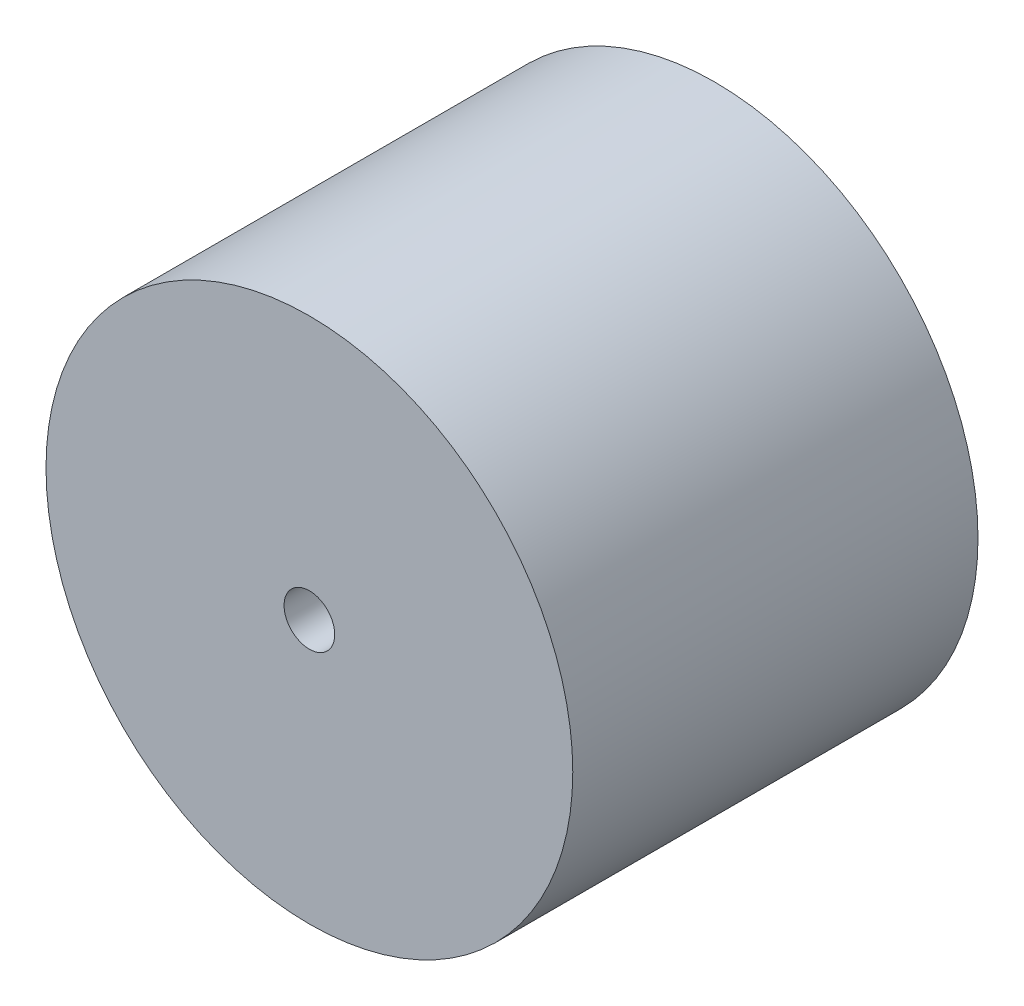
ISO-10303-21;
HEADER;
FILE_DESCRIPTION(('STEP AP214'),'2;1');
FILE_NAME('part.step','',(''),(''),'','','');
FILE_SCHEMA(('AUTOMOTIVE_DESIGN { 1 0 10303 214 1 1 1 1 }'));
ENDSEC;
DATA;
#1=APPLICATION_CONTEXT('core data for automotive mechanical design processes');
#2=APPLICATION_PROTOCOL_DEFINITION('international standard','automotive_design',2000,#1);
#3=PRODUCT_CONTEXT('',#1,'mechanical');
#4=PRODUCT('Part','Part','',(#3));
#5=PRODUCT_RELATED_PRODUCT_CATEGORY('part','',(#4));
#6=PRODUCT_DEFINITION_FORMATION('','',#4);
#7=PRODUCT_DEFINITION_CONTEXT('part definition',#1,'design');
#8=PRODUCT_DEFINITION('design','',#6,#7);
#9=PRODUCT_DEFINITION_SHAPE('','',#8);
#10=(LENGTH_UNIT() NAMED_UNIT(*) SI_UNIT(.MILLI.,.METRE.));
#11=(NAMED_UNIT(*) PLANE_ANGLE_UNIT() SI_UNIT($,.RADIAN.));
#12=(NAMED_UNIT(*) SI_UNIT($,.STERADIAN.) SOLID_ANGLE_UNIT());
#13=UNCERTAINTY_MEASURE_WITH_UNIT(LENGTH_MEASURE(1.E-05),#10,'distance_accuracy_value','');
#14=(GEOMETRIC_REPRESENTATION_CONTEXT(3) GLOBAL_UNCERTAINTY_ASSIGNED_CONTEXT((#13)) GLOBAL_UNIT_ASSIGNED_CONTEXT((#10,
#11,#12)) REPRESENTATION_CONTEXT('',''));
#15=CARTESIAN_POINT('',(0.,0.,0.));
#16=DIRECTION('',(0.,0.,1.));
#17=DIRECTION('',(1.,0.,0.));
#18=AXIS2_PLACEMENT_3D('',#15,#16,#17);
#19=CARTESIAN_POINT('',(0.,0.,25.4));
#20=DIRECTION('',(0.,0.,-1.));
#21=DIRECTION('',(-1.,0.,0.));
#22=AXIS2_PLACEMENT_3D('',#19,#20,#21);
#23=CYLINDRICAL_SURFACE('',#22,16.51);
#24=CARTESIAN_POINT('',(0.,0.,25.4));
#25=DIRECTION('',(0.,0.,1.));
#26=DIRECTION('',(1.,0.,0.));
#27=AXIS2_PLACEMENT_3D('',#24,#25,#26);
#28=CIRCLE('',#27,16.51);
#29=CARTESIAN_POINT('',(16.51,0.,25.4));
#30=VERTEX_POINT('',#29);
#31=EDGE_CURVE('E12',#30,#30,#28,.T.);
#32=ORIENTED_EDGE('',*,*,#31,.F.);
#33=EDGE_LOOP('',(#32));
#34=FACE_BOUND('',#33,.T.);
#35=CARTESIAN_POINT('',(0.,0.,0.));
#36=DIRECTION('',(0.,0.,1.));
#37=DIRECTION('',(1.,0.,0.));
#38=AXIS2_PLACEMENT_3D('',#35,#36,#37);
#39=CIRCLE('',#38,16.51);
#40=CARTESIAN_POINT('',(16.51,0.,0.));
#41=VERTEX_POINT('',#40);
#42=EDGE_CURVE('E45',#41,#41,#39,.T.);
#43=ORIENTED_EDGE('',*,*,#42,.T.);
#44=EDGE_LOOP('',(#43));
#45=FACE_BOUND('',#44,.T.);
#46=ADVANCED_FACE('F42',(#34,#45),#23,.T.);
#47=CARTESIAN_POINT('',(0.,0.,25.4));
#48=DIRECTION('',(0.,0.,1.));
#49=DIRECTION('',(1.,0.,0.));
#50=AXIS2_PLACEMENT_3D('',#47,#48,#49);
#51=PLANE('',#50);
#52=CARTESIAN_POINT('',(0.,0.,25.4));
#53=DIRECTION('',(0.,0.,1.));
#54=DIRECTION('',(1.,0.,0.));
#55=AXIS2_PLACEMENT_3D('',#52,#53,#54);
#56=CIRCLE('',#55,1.5875);
#57=CARTESIAN_POINT('',(1.5875,0.,25.4));
#58=VERTEX_POINT('',#57);
#59=EDGE_CURVE('E54',#58,#58,#56,.T.);
#60=ORIENTED_EDGE('',*,*,#59,.F.);
#61=EDGE_LOOP('',(#60));
#62=FACE_BOUND('',#61,.T.);
#63=ORIENTED_EDGE('',*,*,#31,.T.);
#64=EDGE_LOOP('',(#63));
#65=FACE_BOUND('',#64,.T.);
#66=ADVANCED_FACE('F69',(#62,#65),#51,.T.);
#67=CARTESIAN_POINT('',(0.,0.,0.));
#68=DIRECTION('',(0.,0.,1.));
#69=DIRECTION('',(1.,0.,0.));
#70=AXIS2_PLACEMENT_3D('',#67,#68,#69);
#71=PLANE('',#70);
#72=CARTESIAN_POINT('',(0.,0.,0.));
#73=DIRECTION('',(0.,0.,1.));
#74=DIRECTION('',(1.,0.,0.));
#75=AXIS2_PLACEMENT_3D('',#72,#73,#74);
#76=CIRCLE('',#75,1.5875);
#77=CARTESIAN_POINT('',(1.5875,0.,0.));
#78=VERTEX_POINT('',#77);
#79=EDGE_CURVE('E52',#78,#78,#76,.T.);
#80=ORIENTED_EDGE('',*,*,#79,.T.);
#81=EDGE_LOOP('',(#80));
#82=FACE_BOUND('',#81,.T.);
#83=ORIENTED_EDGE('',*,*,#42,.F.);
#84=EDGE_LOOP('',(#83));
#85=FACE_BOUND('',#84,.T.);
#86=ADVANCED_FACE('F60',(#82,#85),#71,.F.);
#87=CARTESIAN_POINT('',(0.,0.,0.));
#88=DIRECTION('',(0.,0.,1.));
#89=DIRECTION('',(1.,0.,0.));
#90=AXIS2_PLACEMENT_3D('',#87,#88,#89);
#91=CYLINDRICAL_SURFACE('',#90,1.5875);
#92=ORIENTED_EDGE('',*,*,#79,.F.);
#93=EDGE_LOOP('',(#92));
#94=FACE_BOUND('',#93,.T.);
#95=ORIENTED_EDGE('',*,*,#59,.T.);
#96=EDGE_LOOP('',(#95));
#97=FACE_BOUND('',#96,.T.);
#98=ADVANCED_FACE('F63',(#94,#97),#91,.F.);
#99=CLOSED_SHELL('',(#46,#66,#86,#98));
#100=MANIFOLD_SOLID_BREP('B2',#99);
#101=ADVANCED_BREP_SHAPE_REPRESENTATION('',(#18,#100),#14);
#102=SHAPE_DEFINITION_REPRESENTATION(#9,#101);
ENDSEC;
END-ISO-10303-21;
